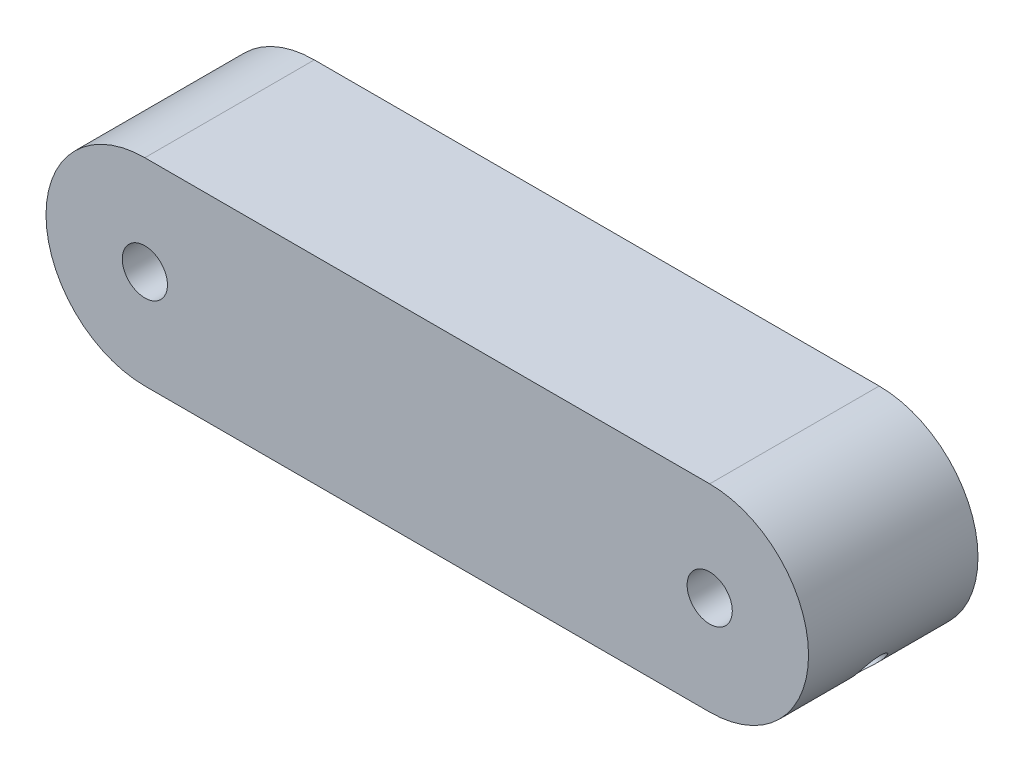
ISO-10303-21;
HEADER;
FILE_DESCRIPTION(('STEP AP214'),'2;1');
FILE_NAME('part.step','',(''),(''),'','','');
FILE_SCHEMA(('AUTOMOTIVE_DESIGN { 1 0 10303 214 1 1 1 1 }'));
ENDSEC;
DATA;
#1=APPLICATION_CONTEXT('core data for automotive mechanical design processes');
#2=APPLICATION_PROTOCOL_DEFINITION('international standard','automotive_design',2000,#1);
#3=PRODUCT_CONTEXT('',#1,'mechanical');
#4=PRODUCT('Part','Part','',(#3));
#5=PRODUCT_RELATED_PRODUCT_CATEGORY('part','',(#4));
#6=PRODUCT_DEFINITION_FORMATION('','',#4);
#7=PRODUCT_DEFINITION_CONTEXT('part definition',#1,'design');
#8=PRODUCT_DEFINITION('design','',#6,#7);
#9=PRODUCT_DEFINITION_SHAPE('','',#8);
#10=(LENGTH_UNIT() NAMED_UNIT(*) SI_UNIT(.MILLI.,.METRE.));
#11=(NAMED_UNIT(*) PLANE_ANGLE_UNIT() SI_UNIT($,.RADIAN.));
#12=(NAMED_UNIT(*) SI_UNIT($,.STERADIAN.) SOLID_ANGLE_UNIT());
#13=UNCERTAINTY_MEASURE_WITH_UNIT(LENGTH_MEASURE(1.E-05),#10,'distance_accuracy_value','');
#14=(GEOMETRIC_REPRESENTATION_CONTEXT(3) GLOBAL_UNCERTAINTY_ASSIGNED_CONTEXT((#13)) GLOBAL_UNIT_ASSIGNED_CONTEXT((#10,
#11,#12)) REPRESENTATION_CONTEXT('',''));
#15=CARTESIAN_POINT('',(0.,0.,0.));
#16=DIRECTION('',(0.,0.,1.));
#17=DIRECTION('',(1.,0.,0.));
#18=AXIS2_PLACEMENT_3D('',#15,#16,#17);
#19=CARTESIAN_POINT('',(0.,0.,6.));
#20=DIRECTION('',(0.,0.,-1.));
#21=DIRECTION('',(-1.,0.,0.));
#22=AXIS2_PLACEMENT_3D('',#19,#20,#21);
#23=CYLINDRICAL_SURFACE('',#22,7.);
#24=CARTESIAN_POINT('',(-5.3619026473818,-4.5,-1.));
#25=CARTESIAN_POINT('',(-5.4164318739015,-4.43502381831984,-1.00000039686136));
#26=CARTESIAN_POINT('',(-5.46982974998658,-4.36898248675141,-0.993676320502719));
#27=CARTESIAN_POINT('',(-5.57292073327303,-4.23669364950667,-0.967065551704443));
#28=CARTESIAN_POINT('',(-5.62261352888263,-4.17044612697697,-0.946777686395559));
#29=CARTESIAN_POINT('',(-5.70599087172207,-4.05530869247342,-0.897348524108033));
#30=CARTESIAN_POINT('',(-5.74074972313415,-4.00589022891493,-0.871259466605775));
#31=CARTESIAN_POINT('',(-5.80625129200333,-3.91034420214609,-0.809648680260884));
#32=CARTESIAN_POINT('',(-5.83699651265529,-3.8642145959903,-0.774132872965879));
#33=CARTESIAN_POINT('',(-5.89382809230452,-3.77697342415825,-0.69339232985595));
#34=CARTESIAN_POINT('',(-5.91987295323836,-3.73590748236745,-0.648088203160986));
#35=CARTESIAN_POINT('',(-5.96604413356741,-3.6617255877044,-0.548749398447488));
#36=CARTESIAN_POINT('',(-5.98617555699088,-3.62860278348303,-0.494722312218561));
#37=CARTESIAN_POINT('',(-6.01732455546665,-3.57667338627354,-0.387914679738785));
#38=CARTESIAN_POINT('',(-6.0292331484488,-3.55649776188564,-0.336058164597518));
#39=CARTESIAN_POINT('',(-6.04773906326503,-3.52493868934133,-0.228843527252596));
#40=CARTESIAN_POINT('',(-6.05434061385526,-3.51354824127738,-0.173488230962139));
#41=CARTESIAN_POINT('',(-6.06159774078735,-3.5010108400602,-0.0674719623557509));
#42=CARTESIAN_POINT('',(-6.06282748186863,-3.49887495041948,-0.0169643907289462));
#43=CARTESIAN_POINT('',(-6.06088505340039,-3.50223884478047,0.0837022491594097));
#44=CARTESIAN_POINT('',(-6.05771418956697,-3.50773636385183,0.133861416359577));
#45=CARTESIAN_POINT('',(-6.04722467675837,-3.52578731553539,0.23079348061757));
#46=CARTESIAN_POINT('',(-6.04003836076621,-3.53811553232059,0.277623192585018));
#47=CARTESIAN_POINT('',(-6.02179596694597,-3.56907467596326,0.368342048356842));
#48=CARTESIAN_POINT('',(-6.01073961448956,-3.58770605010682,0.412230983212243));
#49=CARTESIAN_POINT('',(-5.98455277211729,-3.63122469771296,0.497601539289047));
#50=CARTESIAN_POINT('',(-5.96928978321531,-3.65631327576081,0.538939346855783));
#51=CARTESIAN_POINT('',(-5.93524873236707,-3.71131610774727,0.616641101245621));
#52=CARTESIAN_POINT('',(-5.91646960868693,-3.74123181891137,0.653003539948497));
#53=CARTESIAN_POINT('',(-5.87384645762709,-3.80783827333128,0.723521776876232));
#54=CARTESIAN_POINT('',(-5.84968969464723,-3.84490341349934,0.757133295200214));
#55=CARTESIAN_POINT('',(-5.79817878162646,-3.92215265445427,0.817620420189068));
#56=CARTESIAN_POINT('',(-5.77082312336685,-3.96233822344019,0.844492830563443));
#57=CARTESIAN_POINT('',(-5.70911967635185,-4.05083644300826,0.89511242496807));
#58=CARTESIAN_POINT('',(-5.6743391035976,-4.09946226478217,0.917781326653571));
#59=CARTESIAN_POINT('',(-5.60198461825855,-4.19779772460714,0.954692033070732));
#60=CARTESIAN_POINT('',(-5.56440910530162,-4.24750797190385,0.968928967223078));
#61=CARTESIAN_POINT('',(-5.4796887413647,-4.35644724929487,0.991490276865721));
#62=CARTESIAN_POINT('',(-5.43209292210358,-4.41566908237306,0.998151896520413));
#63=CARTESIAN_POINT('',(-5.33485592746651,-4.53267224416202,1.00118083943032));
#64=CARTESIAN_POINT('',(-5.28521325566139,-4.59045246755853,0.9975404946652));
#65=CARTESIAN_POINT('',(-5.17486253230591,-4.71476291118279,0.979065677782843));
#66=CARTESIAN_POINT('',(-5.11390538191779,-4.78076756610805,0.962162431150871));
#67=CARTESIAN_POINT('',(-4.99187602319315,-4.90804981268187,0.915477212895382));
#68=CARTESIAN_POINT('',(-4.93080376122886,-4.96932339066095,0.885684444729153));
#69=CARTESIAN_POINT('',(-4.81747311942437,-5.07911872638023,0.817498265332208));
#70=CARTESIAN_POINT('',(-4.76501179525555,-5.12829582430416,0.780496664590614));
#71=CARTESIAN_POINT('',(-4.66348383493982,-5.22078482533747,0.695979346177837));
#72=CARTESIAN_POINT('',(-4.61441059098003,-5.26410831246901,0.648484899445744));
#73=CARTESIAN_POINT('',(-4.53942434992017,-5.32870825666502,0.561272745217985));
#74=CARTESIAN_POINT('',(-4.51155234868103,-5.35229278570214,0.524951339940918));
#75=CARTESIAN_POINT('',(-4.45984418283082,-5.39545322448334,0.447357200629437));
#76=CARTESIAN_POINT('',(-4.43600199868091,-5.41503512248379,0.406092011800268));
#77=CARTESIAN_POINT('',(-4.39878370389887,-5.44528686580275,0.328284415649147));
#78=CARTESIAN_POINT('',(-4.38425901252492,-5.45696944700932,0.292693570126015));
#79=CARTESIAN_POINT('',(-4.35986145645103,-5.47648184803168,0.218937252054409));
#80=CARTESIAN_POINT('',(-4.34998380641592,-5.48431563155372,0.180774474494414));
#81=CARTESIAN_POINT('',(-4.33580246677877,-5.49553486335978,0.102407581734549));
#82=CARTESIAN_POINT('',(-4.33154726031867,-5.49888162296564,0.0621887778287079));
#83=CARTESIAN_POINT('',(-4.3293121477775,-5.50064174453621,-0.0185275316092862));
#84=CARTESIAN_POINT('',(-4.33132980483985,-5.49905702226278,-0.059024922818046));
#85=CARTESIAN_POINT('',(-4.34071982509689,-5.49164619484814,-0.133654695924357));
#86=CARTESIAN_POINT('',(-4.34737618795132,-5.4863870042372,-0.167939959381943));
#87=CARTESIAN_POINT('',(-4.36466579482709,-5.47264235470991,-0.234805583564174));
#88=CARTESIAN_POINT('',(-4.37530108624316,-5.46415523479511,-0.267385056703173));
#89=CARTESIAN_POINT('',(-4.40523643019883,-5.44007354636497,-0.344271768058207));
#90=CARTESIAN_POINT('',(-4.42628984240035,-5.42299488130623,-0.387428361501242));
#91=CARTESIAN_POINT('',(-4.47315293159098,-5.38440620951993,-0.468901797072701));
#92=CARTESIAN_POINT('',(-4.49897395405327,-5.36288561763683,-0.507206719151973));
#93=CARTESIAN_POINT('',(-4.56725271236103,-5.30500209272189,-0.596691858092319));
#94=CARTESIAN_POINT('',(-4.61166917333873,-5.26652892169532,-0.645002082052363));
#95=CARTESIAN_POINT('',(-4.70439247394355,-5.18387755579942,-0.732067658662564));
#96=CARTESIAN_POINT('',(-4.75270850670418,-5.13968572221708,-0.770799502944348));
#97=CARTESIAN_POINT('',(-4.86681375962397,-5.03210051334947,-0.850079732025907));
#98=CARTESIAN_POINT('',(-4.93331245823706,-4.96704386512907,-0.887356433146993));
#99=CARTESIAN_POINT('',(-5.06667445533349,-4.83092846414566,-0.946557479173035));
#100=CARTESIAN_POINT('',(-5.13353663130341,-4.75988321691412,-0.968515385093037));
#101=CARTESIAN_POINT('',(-5.22697058981903,-4.65622916281581,-0.98820509457638));
#102=CARTESIAN_POINT('',(-5.25425157576161,-4.62542348777435,-0.992595437244174));
#103=CARTESIAN_POINT('',(-5.30841252796843,-4.56316329321385,-0.998493467785365));
#104=CARTESIAN_POINT('',(-5.33529230068612,-4.53170847693661,-0.999999806331045));
#105=CARTESIAN_POINT('',(-5.3619026473818,-4.5,-1.));
#106=B_SPLINE_CURVE_WITH_KNOTS('',3,(#24,#25,#26,#27,#28,#29,#30,#31,#32,#33,#34,#35,#36,#37,
#38,#39,#40,#41,#42,#43,#44,#45,#46,#47,#48,#49,#50,#51,#52,#53,#54,#55,#56,#57,#58,#59,#60,#61,
#62,#63,#64,#65,#66,#67,#68,#69,#70,#71,#72,#73,#74,#75,#76,#77,#78,#79,#80,#81,#82,#83,#84,#85,
#86,#87,#88,#89,#90,#91,#92,#93,#94,#95,#96,#97,#98,#99,#100,#101,#102,#103,#104,#105),
.UNSPECIFIED.,.T.,.F.,(4,2,2,2,2,2,2,2,2,2,2,2,2,2,2,2,2,2,2,2,2,2,2,2,2,2,2,2,2,2,2,2,2,2,2,2,
2,2,2,2,4),(0.,0.254338019112543,0.5086974036046,0.705358091027014,0.901895534397352,
1.10009126710451,1.29811542629361,1.46785719398903,1.63746357365846,1.7884137673586,
1.93931918176847,2.08552206182801,2.2317353189469,2.38321934955042,2.5347491963361,
2.70078176157615,2.86689292607623,3.05799299029422,3.24920333275084,3.47717165457444,
3.7053097037752,3.97850339393366,4.25192636143748,4.49375143792654,4.7350907164873,
4.88917755730583,5.04303215682556,5.1631151522048,5.28307421883627,5.40406110152843,
5.52500098960079,5.63051123856761,5.73607585365301,5.88811054568136,6.04051180970252,
6.26747757011135,6.49499496776854,6.79418766601897,7.09272280515369,7.21678212202002,
7.34089946786271),.UNSPECIFIED.);
#107=CARTESIAN_POINT('',(-5.3619026473818,-4.5,-1.));
#108=VERTEX_POINT('',#107);
#109=EDGE_CURVE('E122',#108,#108,#106,.T.);
#110=ORIENTED_EDGE('',*,*,#109,.T.);
#111=EDGE_LOOP('',(#110));
#112=FACE_BOUND('',#111,.T.);
#113=CARTESIAN_POINT('',(0.,0.,-6.));
#114=DIRECTION('',(0.,0.,1.));
#115=DIRECTION('',(1.,0.,0.));
#116=AXIS2_PLACEMENT_3D('',#113,#114,#115);
#117=CIRCLE('',#116,7.);
#118=CARTESIAN_POINT('',(0.,7.,-6.));
#119=VERTEX_POINT('',#118);
#120=CARTESIAN_POINT('',(0.,-7.,-6.));
#121=VERTEX_POINT('',#120);
#122=EDGE_CURVE('E104',#119,#121,#117,.T.);
#123=ORIENTED_EDGE('',*,*,#122,.T.);
#124=DIRECTION('',(0.,0.,-1.));
#125=VECTOR('',#124,1.);
#126=CARTESIAN_POINT('',(0.,-7.,6.));
#127=LINE('',#126,#125);
#128=CARTESIAN_POINT('',(0.,-7.,6.));
#129=VERTEX_POINT('',#128);
#130=EDGE_CURVE('E11',#129,#121,#127,.T.);
#131=ORIENTED_EDGE('',*,*,#130,.F.);
#132=CARTESIAN_POINT('',(0.,0.,6.));
#133=DIRECTION('',(0.,0.,1.));
#134=DIRECTION('',(1.,0.,0.));
#135=AXIS2_PLACEMENT_3D('',#132,#133,#134);
#136=CIRCLE('',#135,7.);
#137=CARTESIAN_POINT('',(0.,7.,6.));
#138=VERTEX_POINT('',#137);
#139=EDGE_CURVE('E91',#138,#129,#136,.T.);
#140=ORIENTED_EDGE('',*,*,#139,.F.);
#141=DIRECTION('',(0.,0.,-1.));
#142=VECTOR('',#141,1.);
#143=CARTESIAN_POINT('',(0.,7.,6.));
#144=LINE('',#143,#142);
#145=EDGE_CURVE('E100',#138,#119,#144,.T.);
#146=ORIENTED_EDGE('',*,*,#145,.T.);
#147=EDGE_LOOP('',(#123,#131,#140,#146));
#148=FACE_BOUND('',#147,.T.);
#149=ADVANCED_FACE('F33',(#112,#148),#23,.T.);
#150=CARTESIAN_POINT('',(0.,-7.,6.));
#151=DIRECTION('',(0.,1.,0.));
#152=DIRECTION('',(0.,0.,1.));
#153=AXIS2_PLACEMENT_3D('',#150,#151,#152);
#154=PLANE('',#153);
#155=DIRECTION('',(1.,0.,0.));
#156=VECTOR('',#155,1.);
#157=CARTESIAN_POINT('',(0.,-7.,-6.));
#158=LINE('',#157,#156);
#159=CARTESIAN_POINT('',(40.,-7.,-6.));
#160=VERTEX_POINT('',#159);
#161=EDGE_CURVE('E95',#121,#160,#158,.T.);
#162=ORIENTED_EDGE('',*,*,#161,.T.);
#163=DIRECTION('',(0.,0.,-1.));
#164=VECTOR('',#163,1.);
#165=CARTESIAN_POINT('',(40.,-7.,6.));
#166=LINE('',#165,#164);
#167=CARTESIAN_POINT('',(40.,-7.,6.));
#168=VERTEX_POINT('',#167);
#169=EDGE_CURVE('E48',#168,#160,#166,.T.);
#170=ORIENTED_EDGE('',*,*,#169,.F.);
#171=DIRECTION('',(1.,0.,0.));
#172=VECTOR('',#171,1.);
#173=CARTESIAN_POINT('',(0.,-7.,6.));
#174=LINE('',#173,#172);
#175=EDGE_CURVE('E86',#129,#168,#174,.T.);
#176=ORIENTED_EDGE('',*,*,#175,.F.);
#177=ORIENTED_EDGE('',*,*,#130,.T.);
#178=EDGE_LOOP('',(#162,#170,#176,#177));
#179=FACE_BOUND('',#178,.T.);
#180=ADVANCED_FACE('F94',(#179),#154,.F.);
#181=CARTESIAN_POINT('',(40.,0.,6.));
#182=DIRECTION('',(0.,0.,-1.));
#183=DIRECTION('',(-1.,0.,0.));
#184=AXIS2_PLACEMENT_3D('',#181,#182,#183);
#185=CYLINDRICAL_SURFACE('',#184,7.);
#186=CARTESIAN_POINT('',(45.3619026473818,-4.5,-1.));
#187=CARTESIAN_POINT('',(45.3076483011379,-4.5646455756372,-1.0000016839647));
#188=CARTESIAN_POINT('',(45.2522238298134,-4.62829488153088,-0.993744955112801));
#189=CARTESIAN_POINT('',(45.1401050790914,-4.7525099867641,-0.969667304179423));
#190=CARTESIAN_POINT('',(45.0834073579793,-4.81306547263172,-0.951810119962825));
#191=CARTESIAN_POINT('',(44.9605949686343,-4.93979066979802,-0.901112765298281));
#192=CARTESIAN_POINT('',(44.8945054098028,-5.00518388355806,-0.866253037768473));
#193=CARTESIAN_POINT('',(44.7651425108598,-5.12848289102372,-0.78141186689124));
#194=CARTESIAN_POINT('',(44.7018631862842,-5.18640515054506,-0.731464518056838));
#195=CARTESIAN_POINT('',(44.6078427672026,-5.26971674769012,-0.639973004746461));
#196=CARTESIAN_POINT('',(44.5747184930401,-5.29845799342998,-0.603904422402346));
#197=CARTESIAN_POINT('',(44.5121673045301,-5.3518240007935,-0.525949263194908));
#198=CARTESIAN_POINT('',(44.482734799506,-5.3764550059684,-0.48407169085507));
#199=CARTESIAN_POINT('',(44.4356929545828,-5.41528746441402,-0.404630936386141));
#200=CARTESIAN_POINT('',(44.4169223323484,-5.4305841713095,-0.368299975910065));
#201=CARTESIAN_POINT('',(44.3840031110906,-5.457193900292,-0.292225551727727));
#202=CARTESIAN_POINT('',(44.3698475560102,-5.46851291977041,-0.252487338862925));
#203=CARTESIAN_POINT('',(44.3494387237798,-5.48475380654088,-0.1773982817066));
#204=CARTESIAN_POINT('',(44.3422435767698,-5.49044232408038,-0.142472901002865));
#205=CARTESIAN_POINT('',(44.3325811970807,-5.4980705495499,-0.0715751222137667));
#206=CARTESIAN_POINT('',(44.3301103324095,-5.50001313733191,-0.0356035500505197));
#207=CARTESIAN_POINT('',(44.3301438959334,-5.4999867126892,0.0363791989902169));
#208=CARTESIAN_POINT('',(44.3326542927698,-5.49801300768874,0.0723903716436781));
#209=CARTESIAN_POINT('',(44.3424029450747,-5.49031634440462,0.143355758273847));
#210=CARTESIAN_POINT('',(44.3496447581113,-5.48459056491363,0.17830915619748));
#211=CARTESIAN_POINT('',(44.3704164900677,-5.46805928009463,0.254386920919218));
#212=CARTESIAN_POINT('',(44.3850268713631,-5.45637402034893,0.295021557468033));
#213=CARTESIAN_POINT('',(44.4190388948271,-5.42886488312184,0.372716644061148));
#214=CARTESIAN_POINT('',(44.4384493762101,-5.41303336724393,0.409770322827704));
#215=CARTESIAN_POINT('',(44.4902227013249,-5.37023871902076,0.495907514404109));
#216=CARTESIAN_POINT('',(44.5244908331378,-5.34146717804657,0.54293590578907));
#217=CARTESIAN_POINT('',(44.5974418724672,-5.27881265838699,0.629537241683198));
#218=CARTESIAN_POINT('',(44.6361343207343,-5.24491858068815,0.669093567190581));
#219=CARTESIAN_POINT('',(44.7336722644013,-5.15735328799096,0.757137495804371));
#220=CARTESIAN_POINT('',(44.7939152482199,-5.10152684858968,0.801935948958541));
#221=CARTESIAN_POINT('',(44.9165099360593,-4.98349386604853,0.878162275362011));
#222=CARTESIAN_POINT('',(44.978863687621,-4.92128100158353,0.909576739572048));
#223=CARTESIAN_POINT('',(45.1048940339691,-4.79045588316122,0.959495873803339));
#224=CARTESIAN_POINT('',(45.1685718008319,-4.72173940288718,0.977725690479629));
#225=CARTESIAN_POINT('',(45.2941543402571,-4.58048408078909,0.999307689637424));
#226=CARTESIAN_POINT('',(45.3560607920537,-4.50794905773238,1.00267446041321));
#227=CARTESIAN_POINT('',(45.4661954659727,-4.37343704991232,0.993843819465173));
#228=CARTESIAN_POINT('',(45.514969419743,-4.31174314657575,0.984176162536751));
#229=CARTESIAN_POINT('',(45.608921161332,-4.18878968423195,0.952453015966308));
#230=CARTESIAN_POINT('',(45.6541033896075,-4.12752967696314,0.930413102890366));
#231=CARTESIAN_POINT('',(45.731756831348,-4.01877991865581,0.878276809908124));
#232=CARTESIAN_POINT('',(45.7650427000095,-3.97081801484208,0.850385884833156));
#233=CARTESIAN_POINT('',(45.8275456071631,-3.87850656392925,0.785446037179853));
#234=CARTESIAN_POINT('',(45.8567634637364,-3.83415629127441,0.748398960083409));
#235=CARTESIAN_POINT('',(45.9104835371232,-3.75082217027781,0.665006232453403));
#236=CARTESIAN_POINT('',(45.9349460619613,-3.71188420536147,0.618588401593433));
#237=CARTESIAN_POINT('',(45.97798112979,-3.64217356945867,0.517578053357924));
#238=CARTESIAN_POINT('',(45.9965590556309,-3.61139344044494,0.462993074462916));
#239=CARTESIAN_POINT('',(46.0249335816194,-3.56382300860823,0.355690996055915));
#240=CARTESIAN_POINT('',(46.0356021506838,-3.54566736105749,0.303807855734692));
#241=CARTESIAN_POINT('',(46.0517408755106,-3.51805252169339,0.197010791602957));
#242=CARTESIAN_POINT('',(46.0572148009131,-3.50858702378972,0.1420990962159));
#243=CARTESIAN_POINT('',(46.0625097678334,-3.49942819502922,0.0368637810847853));
#244=CARTESIAN_POINT('',(46.0628492455977,-3.49883866890235,-0.0133582767610484));
#245=CARTESIAN_POINT('',(46.0591928652219,-3.50516697603817,-0.11315866140673));
#246=CARTESIAN_POINT('',(46.0551981164286,-3.51208288828141,-0.162737149642379));
#247=CARTESIAN_POINT('',(46.0431275952534,-3.5328099574178,-0.258638389775925));
#248=CARTESIAN_POINT('',(46.0351517969176,-3.54645210409607,-0.305010666273413));
#249=CARTESIAN_POINT('',(46.015370311038,-3.57990158701089,-0.394596015650368));
#250=CARTESIAN_POINT('',(46.0035642156077,-3.5997095798362,-0.437808751471132));
#251=CARTESIAN_POINT('',(45.9758230650409,-3.64558415716227,-0.521883834074333));
#252=CARTESIAN_POINT('',(45.9597348895946,-3.67187943729778,-0.562570225168024));
#253=CARTESIAN_POINT('',(45.9240752907834,-3.72913776297672,-0.638784846318713));
#254=CARTESIAN_POINT('',(45.9045028937183,-3.760102112967,-0.674311629419584));
#255=CARTESIAN_POINT('',(45.8601457931698,-3.82890677659814,-0.743124788113554));
#256=CARTESIAN_POINT('',(45.8350339485419,-3.86712586930726,-0.775819794084045));
#257=CARTESIAN_POINT('',(45.7816416002007,-3.94650639746086,-0.834314239768958));
#258=CARTESIAN_POINT('',(45.7533589525499,-3.98766981681989,-0.860108973473693));
#259=CARTESIAN_POINT('',(45.6895542649526,-4.07829566729434,-0.908402946340705));
#260=CARTESIAN_POINT('',(45.6535907505535,-4.12805218614833,-0.929763335922345));
#261=CARTESIAN_POINT('',(45.5789487342807,-4.22838585396732,-0.963864928525507));
#262=CARTESIAN_POINT('',(45.5402709065094,-4.27896279679703,-0.976608263298346));
#263=CARTESIAN_POINT('',(45.4555223556206,-4.38663609791379,-0.995249552655124));
#264=CARTESIAN_POINT('',(45.4091563189161,-4.44369592468097,-0.999998533324605));
#265=CARTESIAN_POINT('',(45.3619026473818,-4.5,-1.));
#266=B_SPLINE_CURVE_WITH_KNOTS('',3,(#186,#187,#188,#189,#190,#191,#192,#193,#194,#195,#196,
#197,#198,#199,#200,#201,#202,#203,#204,#205,#206,#207,#208,#209,#210,#211,#212,#213,#214,#215,
#216,#217,#218,#219,#220,#221,#222,#223,#224,#225,#226,#227,#228,#229,#230,#231,#232,#233,#234,
#235,#236,#237,#238,#239,#240,#241,#242,#243,#244,#245,#246,#247,#248,#249,#250,#251,#252,#253,
#254,#255,#256,#257,#258,#259,#260,#261,#262,#263,#264,#265),.UNSPECIFIED.,.T.,.F.,(4,2,2,2,2,2,
2,2,2,2,2,2,2,2,2,2,2,2,2,2,2,2,2,2,2,2,2,2,2,2,2,2,2,2,2,2,2,2,2,4),(0.,0.252962454705665,
0.506719480555564,0.803289204217411,1.09919370018136,1.26912007855703,1.43878593762417,
1.56932432529695,1.69966503953679,1.80752443495276,1.91530087549528,2.02320653378187,
2.13119342022088,2.26465804167589,2.39837028790744,2.59203400562821,2.7861235156459,
3.06531777895097,3.34479110503207,3.62993456632163,3.91479809287078,4.15160722620824,
4.3881188853558,4.58145126297972,4.77474470494122,4.96958810826994,5.16425276327903,
5.33129579796057,5.49821752023293,5.64815763435449,5.79805938030311,5.94437300979598,
6.09070222527087,6.24320200195381,6.39574446330421,6.56373707585392,6.73184396952857,
6.92613122762801,7.12037040389436,7.34069201078308),.UNSPECIFIED.);
#267=CARTESIAN_POINT('',(45.3619026473818,-4.5,-1.));
#268=VERTEX_POINT('',#267);
#269=EDGE_CURVE('E37',#268,#268,#266,.T.);
#270=ORIENTED_EDGE('',*,*,#269,.T.);
#271=EDGE_LOOP('',(#270));
#272=FACE_BOUND('',#271,.T.);
#273=CARTESIAN_POINT('',(40.,0.,-6.));
#274=DIRECTION('',(0.,0.,1.));
#275=DIRECTION('',(1.,0.,0.));
#276=AXIS2_PLACEMENT_3D('',#273,#274,#275);
#277=CIRCLE('',#276,7.);
#278=CARTESIAN_POINT('',(40.,7.,-6.));
#279=VERTEX_POINT('',#278);
#280=EDGE_CURVE('E73',#160,#279,#277,.T.);
#281=ORIENTED_EDGE('',*,*,#280,.T.);
#282=DIRECTION('',(0.,0.,-1.));
#283=VECTOR('',#282,1.);
#284=CARTESIAN_POINT('',(40.,7.,6.));
#285=LINE('',#284,#283);
#286=CARTESIAN_POINT('',(40.,7.,6.));
#287=VERTEX_POINT('',#286);
#288=EDGE_CURVE('E96',#287,#279,#285,.T.);
#289=ORIENTED_EDGE('',*,*,#288,.F.);
#290=CARTESIAN_POINT('',(40.,0.,6.));
#291=DIRECTION('',(0.,0.,1.));
#292=DIRECTION('',(1.,0.,0.));
#293=AXIS2_PLACEMENT_3D('',#290,#291,#292);
#294=CIRCLE('',#293,7.);
#295=EDGE_CURVE('E89',#168,#287,#294,.T.);
#296=ORIENTED_EDGE('',*,*,#295,.F.);
#297=ORIENTED_EDGE('',*,*,#169,.T.);
#298=EDGE_LOOP('',(#281,#289,#296,#297));
#299=FACE_BOUND('',#298,.T.);
#300=ADVANCED_FACE('F98',(#272,#299),#185,.T.);
#301=CARTESIAN_POINT('',(0.,7.,6.));
#302=DIRECTION('',(0.,-1.,0.));
#303=DIRECTION('',(0.,0.,-1.));
#304=AXIS2_PLACEMENT_3D('',#301,#302,#303);
#305=PLANE('',#304);
#306=DIRECTION('',(-1.,0.,0.));
#307=VECTOR('',#306,1.);
#308=CARTESIAN_POINT('',(0.,7.,-6.));
#309=LINE('',#308,#307);
#310=EDGE_CURVE('E79',#279,#119,#309,.T.);
#311=ORIENTED_EDGE('',*,*,#310,.T.);
#312=ORIENTED_EDGE('',*,*,#145,.F.);
#313=DIRECTION('',(-1.,0.,0.));
#314=VECTOR('',#313,1.);
#315=CARTESIAN_POINT('',(0.,7.,6.));
#316=LINE('',#315,#314);
#317=EDGE_CURVE('E56',#287,#138,#316,.T.);
#318=ORIENTED_EDGE('',*,*,#317,.F.);
#319=ORIENTED_EDGE('',*,*,#288,.T.);
#320=EDGE_LOOP('',(#311,#312,#318,#319));
#321=FACE_BOUND('',#320,.T.);
#322=ADVANCED_FACE('F112',(#321),#305,.F.);
#323=CARTESIAN_POINT('',(0.,0.,6.));
#324=DIRECTION('',(0.,0.,1.));
#325=DIRECTION('',(1.,0.,0.));
#326=AXIS2_PLACEMENT_3D('',#323,#324,#325);
#327=PLANE('',#326);
#328=CARTESIAN_POINT('',(0.,0.,6.));
#329=DIRECTION('',(0.,0.,1.));
#330=DIRECTION('',(1.,0.,0.));
#331=AXIS2_PLACEMENT_3D('',#328,#329,#330);
#332=CIRCLE('',#331,1.6);
#333=CARTESIAN_POINT('',(1.6,0.,6.));
#334=VERTEX_POINT('',#333);
#335=EDGE_CURVE('E125',#334,#334,#332,.T.);
#336=ORIENTED_EDGE('',*,*,#335,.F.);
#337=EDGE_LOOP('',(#336));
#338=FACE_BOUND('',#337,.T.);
#339=CARTESIAN_POINT('',(40.,0.,6.));
#340=DIRECTION('',(0.,0.,1.));
#341=DIRECTION('',(1.,0.,0.));
#342=AXIS2_PLACEMENT_3D('',#339,#340,#341);
#343=CIRCLE('',#342,1.6);
#344=CARTESIAN_POINT('',(41.6,0.,6.));
#345=VERTEX_POINT('',#344);
#346=EDGE_CURVE('E118',#345,#345,#343,.T.);
#347=ORIENTED_EDGE('',*,*,#346,.F.);
#348=EDGE_LOOP('',(#347));
#349=FACE_BOUND('',#348,.T.);
#350=ORIENTED_EDGE('',*,*,#139,.T.);
#351=ORIENTED_EDGE('',*,*,#175,.T.);
#352=ORIENTED_EDGE('',*,*,#295,.T.);
#353=ORIENTED_EDGE('',*,*,#317,.T.);
#354=EDGE_LOOP('',(#350,#351,#352,#353));
#355=FACE_BOUND('',#354,.T.);
#356=ADVANCED_FACE('F87',(#338,#349,#355),#327,.T.);
#357=CARTESIAN_POINT('',(0.,0.,-6.));
#358=DIRECTION('',(0.,0.,1.));
#359=DIRECTION('',(1.,0.,0.));
#360=AXIS2_PLACEMENT_3D('',#357,#358,#359);
#361=PLANE('',#360);
#362=CARTESIAN_POINT('',(0.,0.,-6.));
#363=DIRECTION('',(0.,0.,1.));
#364=DIRECTION('',(1.,0.,0.));
#365=AXIS2_PLACEMENT_3D('',#362,#363,#364);
#366=CIRCLE('',#365,1.6);
#367=CARTESIAN_POINT('',(1.6,0.,-6.));
#368=VERTEX_POINT('',#367);
#369=EDGE_CURVE('E107',#368,#368,#366,.T.);
#370=ORIENTED_EDGE('',*,*,#369,.T.);
#371=EDGE_LOOP('',(#370));
#372=FACE_BOUND('',#371,.T.);
#373=CARTESIAN_POINT('',(40.,0.,-6.));
#374=DIRECTION('',(0.,0.,1.));
#375=DIRECTION('',(1.,0.,0.));
#376=AXIS2_PLACEMENT_3D('',#373,#374,#375);
#377=CIRCLE('',#376,1.6);
#378=CARTESIAN_POINT('',(41.6,0.,-6.));
#379=VERTEX_POINT('',#378);
#380=EDGE_CURVE('E121',#379,#379,#377,.T.);
#381=ORIENTED_EDGE('',*,*,#380,.T.);
#382=EDGE_LOOP('',(#381));
#383=FACE_BOUND('',#382,.T.);
#384=ORIENTED_EDGE('',*,*,#122,.F.);
#385=ORIENTED_EDGE('',*,*,#310,.F.);
#386=ORIENTED_EDGE('',*,*,#280,.F.);
#387=ORIENTED_EDGE('',*,*,#161,.F.);
#388=EDGE_LOOP('',(#384,#385,#386,#387));
#389=FACE_BOUND('',#388,.T.);
#390=ADVANCED_FACE('F115',(#372,#383,#389),#361,.F.);
#391=CARTESIAN_POINT('',(40.,0.,-6.));
#392=DIRECTION('',(0.,0.,1.));
#393=DIRECTION('',(1.,0.,0.));
#394=AXIS2_PLACEMENT_3D('',#391,#392,#393);
#395=CYLINDRICAL_SURFACE('',#394,1.6);
#396=ORIENTED_EDGE('',*,*,#380,.F.);
#397=EDGE_LOOP('',(#396));
#398=FACE_BOUND('',#397,.T.);
#399=ORIENTED_EDGE('',*,*,#346,.T.);
#400=EDGE_LOOP('',(#399));
#401=FACE_BOUND('',#400,.T.);
#402=ADVANCED_FACE('F143',(#398,#401),#395,.F.);
#403=CARTESIAN_POINT('',(0.,0.,-6.));
#404=DIRECTION('',(0.,0.,1.));
#405=DIRECTION('',(1.,0.,0.));
#406=AXIS2_PLACEMENT_3D('',#403,#404,#405);
#407=CYLINDRICAL_SURFACE('',#406,1.6);
#408=ORIENTED_EDGE('',*,*,#369,.F.);
#409=EDGE_LOOP('',(#408));
#410=FACE_BOUND('',#409,.T.);
#411=ORIENTED_EDGE('',*,*,#335,.T.);
#412=EDGE_LOOP('',(#411));
#413=FACE_BOUND('',#412,.T.);
#414=ADVANCED_FACE('F138',(#410,#413),#407,.F.);
#415=CARTESIAN_POINT('',(-60.,-4.5,0.));
#416=DIRECTION('',(1.,0.,0.));
#417=DIRECTION('',(0.,0.,-1.));
#418=AXIS2_PLACEMENT_3D('',#415,#416,#417);
#419=CYLINDRICAL_SURFACE('',#418,1.);
#420=ORIENTED_EDGE('',*,*,#269,.F.);
#421=EDGE_LOOP('',(#420));
#422=FACE_BOUND('',#421,.T.);
#423=ORIENTED_EDGE('',*,*,#109,.F.);
#424=EDGE_LOOP('',(#423));
#425=FACE_BOUND('',#424,.T.);
#426=ADVANCED_FACE('F134',(#422,#425),#419,.F.);
#427=CLOSED_SHELL('',(#149,#180,#300,#322,#356,#390,#402,#414,#426));
#428=MANIFOLD_SOLID_BREP('B2',#427);
#429=ADVANCED_BREP_SHAPE_REPRESENTATION('',(#18,#428),#14);
#430=SHAPE_DEFINITION_REPRESENTATION(#9,#429);
ENDSEC;
END-ISO-10303-21;
